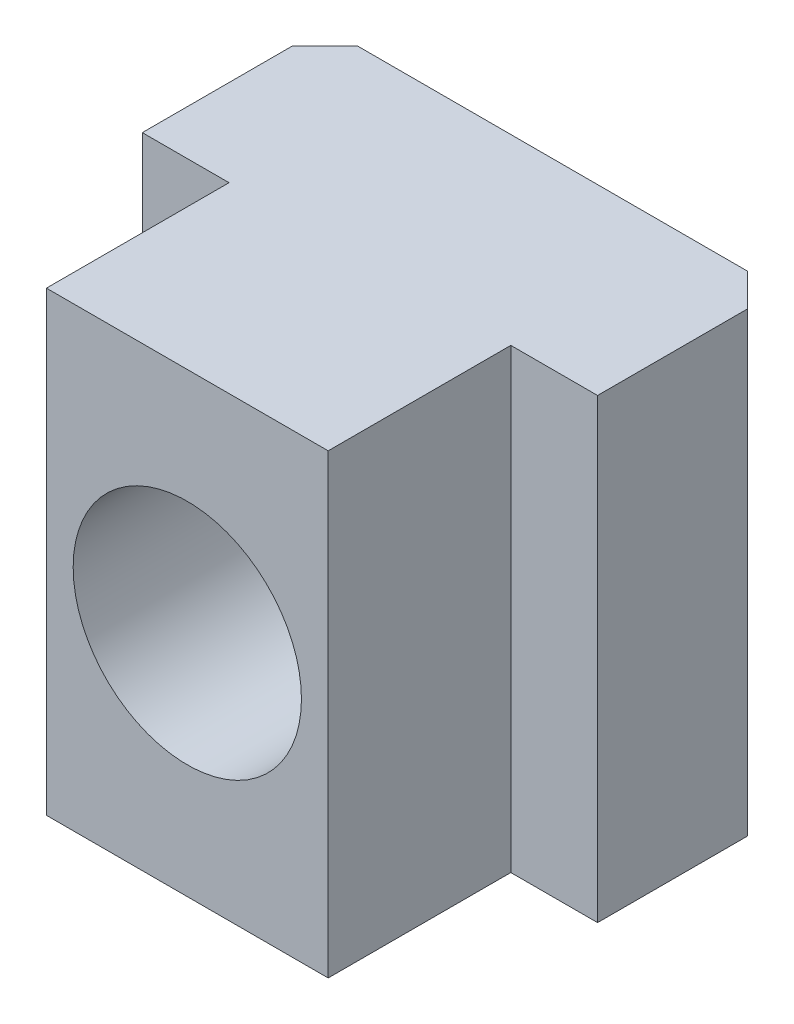
ISO-10303-21;
HEADER;
FILE_DESCRIPTION(('STEP AP214'),'2;1');
FILE_NAME('part.step','',(''),(''),'','','');
FILE_SCHEMA(('AUTOMOTIVE_DESIGN { 1 0 10303 214 1 1 1 1 }'));
ENDSEC;
DATA;
#1=APPLICATION_CONTEXT('core data for automotive mechanical design processes');
#2=APPLICATION_PROTOCOL_DEFINITION('international standard','automotive_design',2000,#1);
#3=PRODUCT_CONTEXT('',#1,'mechanical');
#4=PRODUCT('Part','Part','',(#3));
#5=PRODUCT_RELATED_PRODUCT_CATEGORY('part','',(#4));
#6=PRODUCT_DEFINITION_FORMATION('','',#4);
#7=PRODUCT_DEFINITION_CONTEXT('part definition',#1,'design');
#8=PRODUCT_DEFINITION('design','',#6,#7);
#9=PRODUCT_DEFINITION_SHAPE('','',#8);
#10=(LENGTH_UNIT() NAMED_UNIT(*) SI_UNIT(.MILLI.,.METRE.));
#11=(NAMED_UNIT(*) PLANE_ANGLE_UNIT() SI_UNIT($,.RADIAN.));
#12=(NAMED_UNIT(*) SI_UNIT($,.STERADIAN.) SOLID_ANGLE_UNIT());
#13=UNCERTAINTY_MEASURE_WITH_UNIT(LENGTH_MEASURE(1.E-05),#10,'distance_accuracy_value','');
#14=(GEOMETRIC_REPRESENTATION_CONTEXT(3) GLOBAL_UNCERTAINTY_ASSIGNED_CONTEXT((#13)) GLOBAL_UNIT_ASSIGNED_CONTEXT((#10,
#11,#12)) REPRESENTATION_CONTEXT('',''));
#15=CARTESIAN_POINT('',(0.,0.,0.));
#16=DIRECTION('',(0.,0.,1.));
#17=DIRECTION('',(1.,0.,0.));
#18=AXIS2_PLACEMENT_3D('',#15,#16,#17);
#19=CARTESIAN_POINT('',(-10.8,17.5,14.));
#20=DIRECTION('',(1.,0.,0.));
#21=DIRECTION('',(0.,0.,-1.));
#22=AXIS2_PLACEMENT_3D('',#19,#20,#21);
#23=PLANE('',#22);
#24=DIRECTION('',(0.,0.,1.));
#25=VECTOR('',#24,1.);
#26=CARTESIAN_POINT('',(-10.8,-17.5,14.));
#27=LINE('',#26,#25);
#28=CARTESIAN_POINT('',(-10.8,-17.5,0.));
#29=VERTEX_POINT('',#28);
#30=CARTESIAN_POINT('',(-10.8,-17.5,14.));
#31=VERTEX_POINT('',#30);
#32=EDGE_CURVE('E144',#29,#31,#27,.T.);
#33=ORIENTED_EDGE('',*,*,#32,.T.);
#34=DIRECTION('',(0.,-1.,0.));
#35=VECTOR('',#34,1.);
#36=CARTESIAN_POINT('',(-10.8,17.5,14.));
#37=LINE('',#36,#35);
#38=CARTESIAN_POINT('',(-10.8,17.5,14.));
#39=VERTEX_POINT('',#38);
#40=EDGE_CURVE('E11',#39,#31,#37,.T.);
#41=ORIENTED_EDGE('',*,*,#40,.F.);
#42=DIRECTION('',(0.,0.,1.));
#43=VECTOR('',#42,1.);
#44=CARTESIAN_POINT('',(-10.8,17.5,14.));
#45=LINE('',#44,#43);
#46=CARTESIAN_POINT('',(-10.8,17.5,0.));
#47=VERTEX_POINT('',#46);
#48=EDGE_CURVE('E163',#47,#39,#45,.T.);
#49=ORIENTED_EDGE('',*,*,#48,.F.);
#50=DIRECTION('',(0.,-1.,0.));
#51=VECTOR('',#50,1.);
#52=CARTESIAN_POINT('',(-10.8,17.5,0.));
#53=LINE('',#52,#51);
#54=EDGE_CURVE('E140',#47,#29,#53,.T.);
#55=ORIENTED_EDGE('',*,*,#54,.T.);
#56=EDGE_LOOP('',(#33,#41,#49,#55));
#57=FACE_BOUND('',#56,.T.);
#58=ADVANCED_FACE('F36',(#57),#23,.F.);
#59=CARTESIAN_POINT('',(10.8,17.5,14.));
#60=DIRECTION('',(0.,0.,-1.));
#61=DIRECTION('',(-1.,0.,0.));
#62=AXIS2_PLACEMENT_3D('',#59,#60,#61);
#63=PLANE('',#62);
#64=CARTESIAN_POINT('',(0.,0.,14.));
#65=DIRECTION('',(0.,0.,1.));
#66=DIRECTION('',(1.,0.,0.));
#67=AXIS2_PLACEMENT_3D('',#64,#65,#66);
#68=CIRCLE('',#67,8.75);
#69=CARTESIAN_POINT('',(8.75,0.,14.));
#70=VERTEX_POINT('',#69);
#71=EDGE_CURVE('E212',#70,#70,#68,.T.);
#72=ORIENTED_EDGE('',*,*,#71,.F.);
#73=EDGE_LOOP('',(#72));
#74=FACE_BOUND('',#73,.T.);
#75=DIRECTION('',(1.,0.,0.));
#76=VECTOR('',#75,1.);
#77=CARTESIAN_POINT('',(10.8,-17.5,14.));
#78=LINE('',#77,#76);
#79=CARTESIAN_POINT('',(10.8,-17.5,14.));
#80=VERTEX_POINT('',#79);
#81=EDGE_CURVE('E147',#31,#80,#78,.T.);
#82=ORIENTED_EDGE('',*,*,#81,.T.);
#83=DIRECTION('',(0.,-1.,0.));
#84=VECTOR('',#83,1.);
#85=CARTESIAN_POINT('',(10.8,17.5,14.));
#86=LINE('',#85,#84);
#87=CARTESIAN_POINT('',(10.8,17.5,14.));
#88=VERTEX_POINT('',#87);
#89=EDGE_CURVE('E44',#88,#80,#86,.T.);
#90=ORIENTED_EDGE('',*,*,#89,.F.);
#91=DIRECTION('',(1.,0.,0.));
#92=VECTOR('',#91,1.);
#93=CARTESIAN_POINT('',(10.8,17.5,14.));
#94=LINE('',#93,#92);
#95=EDGE_CURVE('E101',#39,#88,#94,.T.);
#96=ORIENTED_EDGE('',*,*,#95,.F.);
#97=ORIENTED_EDGE('',*,*,#40,.T.);
#98=EDGE_LOOP('',(#82,#90,#96,#97));
#99=FACE_BOUND('',#98,.T.);
#100=ADVANCED_FACE('F218',(#74,#99),#63,.F.);
#101=CARTESIAN_POINT('',(10.8,17.5,0.));
#102=DIRECTION('',(-1.,0.,0.));
#103=DIRECTION('',(0.,0.,1.));
#104=AXIS2_PLACEMENT_3D('',#101,#102,#103);
#105=PLANE('',#104);
#106=DIRECTION('',(0.,0.,-1.));
#107=VECTOR('',#106,1.);
#108=CARTESIAN_POINT('',(10.8,-17.5,0.));
#109=LINE('',#108,#107);
#110=CARTESIAN_POINT('',(10.8,-17.5,0.));
#111=VERTEX_POINT('',#110);
#112=EDGE_CURVE('E150',#80,#111,#109,.T.);
#113=ORIENTED_EDGE('',*,*,#112,.T.);
#114=DIRECTION('',(0.,-1.,0.));
#115=VECTOR('',#114,1.);
#116=CARTESIAN_POINT('',(10.8,17.5,0.));
#117=LINE('',#116,#115);
#118=CARTESIAN_POINT('',(10.8,17.5,0.));
#119=VERTEX_POINT('',#118);
#120=EDGE_CURVE('E176',#119,#111,#117,.T.);
#121=ORIENTED_EDGE('',*,*,#120,.F.);
#122=DIRECTION('',(0.,0.,-1.));
#123=VECTOR('',#122,1.);
#124=CARTESIAN_POINT('',(10.8,17.5,0.));
#125=LINE('',#124,#123);
#126=EDGE_CURVE('E184',#88,#119,#125,.T.);
#127=ORIENTED_EDGE('',*,*,#126,.F.);
#128=ORIENTED_EDGE('',*,*,#89,.T.);
#129=EDGE_LOOP('',(#113,#121,#127,#128));
#130=FACE_BOUND('',#129,.T.);
#131=ADVANCED_FACE('F182',(#130),#105,.F.);
#132=CARTESIAN_POINT('',(17.45,17.5,0.));
#133=DIRECTION('',(0.,0.,-1.));
#134=DIRECTION('',(-1.,0.,0.));
#135=AXIS2_PLACEMENT_3D('',#132,#133,#134);
#136=PLANE('',#135);
#137=DIRECTION('',(1.,0.,0.));
#138=VECTOR('',#137,1.);
#139=CARTESIAN_POINT('',(17.45,-17.5,0.));
#140=LINE('',#139,#138);
#141=CARTESIAN_POINT('',(17.45,-17.5,0.));
#142=VERTEX_POINT('',#141);
#143=EDGE_CURVE('E152',#111,#142,#140,.T.);
#144=ORIENTED_EDGE('',*,*,#143,.T.);
#145=DIRECTION('',(0.,-1.,0.));
#146=VECTOR('',#145,1.);
#147=CARTESIAN_POINT('',(17.45,17.5,0.));
#148=LINE('',#147,#146);
#149=CARTESIAN_POINT('',(17.45,17.5,0.));
#150=VERTEX_POINT('',#149);
#151=EDGE_CURVE('E173',#150,#142,#148,.T.);
#152=ORIENTED_EDGE('',*,*,#151,.F.);
#153=DIRECTION('',(1.,0.,0.));
#154=VECTOR('',#153,1.);
#155=CARTESIAN_POINT('',(17.45,17.5,0.));
#156=LINE('',#155,#154);
#157=EDGE_CURVE('E202',#119,#150,#156,.T.);
#158=ORIENTED_EDGE('',*,*,#157,.F.);
#159=ORIENTED_EDGE('',*,*,#120,.T.);
#160=EDGE_LOOP('',(#144,#152,#158,#159));
#161=FACE_BOUND('',#160,.T.);
#162=ADVANCED_FACE('F193',(#161),#136,.F.);
#163=CARTESIAN_POINT('',(17.45,17.5,-11.5));
#164=DIRECTION('',(-1.,0.,0.));
#165=DIRECTION('',(0.,0.,1.));
#166=AXIS2_PLACEMENT_3D('',#163,#164,#165);
#167=PLANE('',#166);
#168=DIRECTION('',(0.,0.,-1.));
#169=VECTOR('',#168,1.);
#170=CARTESIAN_POINT('',(17.45,-17.5,-11.5));
#171=LINE('',#170,#169);
#172=CARTESIAN_POINT('',(17.45,-17.5,-11.5));
#173=VERTEX_POINT('',#172);
#174=EDGE_CURVE('E154',#142,#173,#171,.T.);
#175=ORIENTED_EDGE('',*,*,#174,.T.);
#176=DIRECTION('',(0.,-1.,0.));
#177=VECTOR('',#176,1.);
#178=CARTESIAN_POINT('',(17.45,17.5,-11.5));
#179=LINE('',#178,#177);
#180=CARTESIAN_POINT('',(17.45,17.5,-11.5));
#181=VERTEX_POINT('',#180);
#182=EDGE_CURVE('E170',#181,#173,#179,.T.);
#183=ORIENTED_EDGE('',*,*,#182,.F.);
#184=DIRECTION('',(0.,0.,-1.));
#185=VECTOR('',#184,1.);
#186=CARTESIAN_POINT('',(17.45,17.5,-11.5));
#187=LINE('',#186,#185);
#188=EDGE_CURVE('E199',#150,#181,#187,.T.);
#189=ORIENTED_EDGE('',*,*,#188,.F.);
#190=ORIENTED_EDGE('',*,*,#151,.T.);
#191=EDGE_LOOP('',(#175,#183,#189,#190));
#192=FACE_BOUND('',#191,.T.);
#193=ADVANCED_FACE('F197',(#192),#167,.F.);
#194=CARTESIAN_POINT('',(14.95,17.5,-14.));
#195=DIRECTION('',(-0.707106781186548,0.,0.707106781186548));
#196=DIRECTION('',(0.707106781186548,0.,0.707106781186548));
#197=AXIS2_PLACEMENT_3D('',#194,#195,#196);
#198=PLANE('',#197);
#199=DIRECTION('',(-0.707106781186548,0.,-0.707106781186548));
#200=VECTOR('',#199,1.);
#201=CARTESIAN_POINT('',(14.95,-17.5,-14.));
#202=LINE('',#201,#200);
#203=CARTESIAN_POINT('',(14.95,-17.5,-14.));
#204=VERTEX_POINT('',#203);
#205=EDGE_CURVE('E156',#173,#204,#202,.T.);
#206=ORIENTED_EDGE('',*,*,#205,.T.);
#207=DIRECTION('',(0.,-1.,0.));
#208=VECTOR('',#207,1.);
#209=CARTESIAN_POINT('',(14.95,17.5,-14.));
#210=LINE('',#209,#208);
#211=CARTESIAN_POINT('',(14.95,17.5,-14.));
#212=VERTEX_POINT('',#211);
#213=EDGE_CURVE('E167',#212,#204,#210,.T.);
#214=ORIENTED_EDGE('',*,*,#213,.F.);
#215=DIRECTION('',(-0.707106781186548,0.,-0.707106781186548));
#216=VECTOR('',#215,1.);
#217=CARTESIAN_POINT('',(14.95,17.5,-14.));
#218=LINE('',#217,#216);
#219=EDGE_CURVE('E201',#181,#212,#218,.T.);
#220=ORIENTED_EDGE('',*,*,#219,.F.);
#221=ORIENTED_EDGE('',*,*,#182,.T.);
#222=EDGE_LOOP('',(#206,#214,#220,#221));
#223=FACE_BOUND('',#222,.T.);
#224=ADVANCED_FACE('F228',(#223),#198,.F.);
#225=CARTESIAN_POINT('',(-14.95,17.5,-14.));
#226=DIRECTION('',(0.,0.,1.));
#227=DIRECTION('',(1.,0.,0.));
#228=AXIS2_PLACEMENT_3D('',#225,#226,#227);
#229=PLANE('',#228);
#230=CARTESIAN_POINT('',(0.,0.,-14.));
#231=DIRECTION('',(0.,0.,1.));
#232=DIRECTION('',(1.,0.,0.));
#233=AXIS2_PLACEMENT_3D('',#230,#231,#232);
#234=CIRCLE('',#233,8.75);
#235=CARTESIAN_POINT('',(8.75,0.,-14.));
#236=VERTEX_POINT('',#235);
#237=EDGE_CURVE('E148',#236,#236,#234,.T.);
#238=ORIENTED_EDGE('',*,*,#237,.T.);
#239=EDGE_LOOP('',(#238));
#240=FACE_BOUND('',#239,.T.);
#241=DIRECTION('',(-1.,0.,0.));
#242=VECTOR('',#241,1.);
#243=CARTESIAN_POINT('',(-14.95,-17.5,-14.));
#244=LINE('',#243,#242);
#245=CARTESIAN_POINT('',(-14.95,-17.5,-14.));
#246=VERTEX_POINT('',#245);
#247=EDGE_CURVE('E158',#204,#246,#244,.T.);
#248=ORIENTED_EDGE('',*,*,#247,.T.);
#249=DIRECTION('',(0.,-1.,0.));
#250=VECTOR('',#249,1.);
#251=CARTESIAN_POINT('',(-14.95,17.5,-14.));
#252=LINE('',#251,#250);
#253=CARTESIAN_POINT('',(-14.95,17.5,-14.));
#254=VERTEX_POINT('',#253);
#255=EDGE_CURVE('E135',#254,#246,#252,.T.);
#256=ORIENTED_EDGE('',*,*,#255,.F.);
#257=DIRECTION('',(-1.,0.,0.));
#258=VECTOR('',#257,1.);
#259=CARTESIAN_POINT('',(-14.95,17.5,-14.));
#260=LINE('',#259,#258);
#261=EDGE_CURVE('E126',#212,#254,#260,.T.);
#262=ORIENTED_EDGE('',*,*,#261,.F.);
#263=ORIENTED_EDGE('',*,*,#213,.T.);
#264=EDGE_LOOP('',(#248,#256,#262,#263));
#265=FACE_BOUND('',#264,.T.);
#266=ADVANCED_FACE('F225',(#240,#265),#229,.F.);
#267=CARTESIAN_POINT('',(-17.45,17.5,-11.5));
#268=DIRECTION('',(0.707106781186548,0.,0.707106781186548));
#269=DIRECTION('',(0.707106781186548,0.,-0.707106781186548));
#270=AXIS2_PLACEMENT_3D('',#267,#268,#269);
#271=PLANE('',#270);
#272=DIRECTION('',(-0.707106781186548,0.,0.707106781186548));
#273=VECTOR('',#272,1.);
#274=CARTESIAN_POINT('',(-17.45,-17.5,-11.5));
#275=LINE('',#274,#273);
#276=CARTESIAN_POINT('',(-17.45,-17.5,-11.5));
#277=VERTEX_POINT('',#276);
#278=EDGE_CURVE('E134',#246,#277,#275,.T.);
#279=ORIENTED_EDGE('',*,*,#278,.T.);
#280=DIRECTION('',(0.,-1.,0.));
#281=VECTOR('',#280,1.);
#282=CARTESIAN_POINT('',(-17.45,17.5,-11.5));
#283=LINE('',#282,#281);
#284=CARTESIAN_POINT('',(-17.45,17.5,-11.5));
#285=VERTEX_POINT('',#284);
#286=EDGE_CURVE('E131',#285,#277,#283,.T.);
#287=ORIENTED_EDGE('',*,*,#286,.F.);
#288=DIRECTION('',(-0.707106781186548,0.,0.707106781186548));
#289=VECTOR('',#288,1.);
#290=CARTESIAN_POINT('',(-17.45,17.5,-11.5));
#291=LINE('',#290,#289);
#292=EDGE_CURVE('E120',#254,#285,#291,.T.);
#293=ORIENTED_EDGE('',*,*,#292,.F.);
#294=ORIENTED_EDGE('',*,*,#255,.T.);
#295=EDGE_LOOP('',(#279,#287,#293,#294));
#296=FACE_BOUND('',#295,.T.);
#297=ADVANCED_FACE('F132',(#296),#271,.F.);
#298=CARTESIAN_POINT('',(-17.45,17.5,0.));
#299=DIRECTION('',(1.,0.,0.));
#300=DIRECTION('',(0.,0.,-1.));
#301=AXIS2_PLACEMENT_3D('',#298,#299,#300);
#302=PLANE('',#301);
#303=DIRECTION('',(0.,0.,1.));
#304=VECTOR('',#303,1.);
#305=CARTESIAN_POINT('',(-17.45,-17.5,0.));
#306=LINE('',#305,#304);
#307=CARTESIAN_POINT('',(-17.45,-17.5,0.));
#308=VERTEX_POINT('',#307);
#309=EDGE_CURVE('E87',#277,#308,#306,.T.);
#310=ORIENTED_EDGE('',*,*,#309,.T.);
#311=DIRECTION('',(0.,-1.,0.));
#312=VECTOR('',#311,1.);
#313=CARTESIAN_POINT('',(-17.45,17.5,0.));
#314=LINE('',#313,#312);
#315=CARTESIAN_POINT('',(-17.45,17.5,0.));
#316=VERTEX_POINT('',#315);
#317=EDGE_CURVE('E136',#316,#308,#314,.T.);
#318=ORIENTED_EDGE('',*,*,#317,.F.);
#319=DIRECTION('',(0.,0.,1.));
#320=VECTOR('',#319,1.);
#321=CARTESIAN_POINT('',(-17.45,17.5,0.));
#322=LINE('',#321,#320);
#323=EDGE_CURVE('E124',#285,#316,#322,.T.);
#324=ORIENTED_EDGE('',*,*,#323,.F.);
#325=ORIENTED_EDGE('',*,*,#286,.T.);
#326=EDGE_LOOP('',(#310,#318,#324,#325));
#327=FACE_BOUND('',#326,.T.);
#328=ADVANCED_FACE('F138',(#327),#302,.F.);
#329=CARTESIAN_POINT('',(-10.8,17.5,0.));
#330=DIRECTION('',(0.,0.,-1.));
#331=DIRECTION('',(-1.,0.,0.));
#332=AXIS2_PLACEMENT_3D('',#329,#330,#331);
#333=PLANE('',#332);
#334=DIRECTION('',(1.,0.,0.));
#335=VECTOR('',#334,1.);
#336=CARTESIAN_POINT('',(-10.8,-17.5,0.));
#337=LINE('',#336,#335);
#338=EDGE_CURVE('E93',#308,#29,#337,.T.);
#339=ORIENTED_EDGE('',*,*,#338,.T.);
#340=ORIENTED_EDGE('',*,*,#54,.F.);
#341=DIRECTION('',(1.,0.,0.));
#342=VECTOR('',#341,1.);
#343=CARTESIAN_POINT('',(-10.8,17.5,0.));
#344=LINE('',#343,#342);
#345=EDGE_CURVE('E52',#316,#47,#344,.T.);
#346=ORIENTED_EDGE('',*,*,#345,.F.);
#347=ORIENTED_EDGE('',*,*,#317,.T.);
#348=EDGE_LOOP('',(#339,#340,#346,#347));
#349=FACE_BOUND('',#348,.T.);
#350=ADVANCED_FACE('F285',(#349),#333,.F.);
#351=CARTESIAN_POINT('',(0.,17.5,0.));
#352=DIRECTION('',(0.,1.,0.));
#353=DIRECTION('',(0.,0.,1.));
#354=AXIS2_PLACEMENT_3D('',#351,#352,#353);
#355=PLANE('',#354);
#356=ORIENTED_EDGE('',*,*,#48,.T.);
#357=ORIENTED_EDGE('',*,*,#95,.T.);
#358=ORIENTED_EDGE('',*,*,#126,.T.);
#359=ORIENTED_EDGE('',*,*,#157,.T.);
#360=ORIENTED_EDGE('',*,*,#188,.T.);
#361=ORIENTED_EDGE('',*,*,#219,.T.);
#362=ORIENTED_EDGE('',*,*,#261,.T.);
#363=ORIENTED_EDGE('',*,*,#292,.T.);
#364=ORIENTED_EDGE('',*,*,#323,.T.);
#365=ORIENTED_EDGE('',*,*,#345,.T.);
#366=EDGE_LOOP('',(#356,#357,#358,#359,#360,#361,#362,#363,#364,#365));
#367=FACE_BOUND('',#366,.T.);
#368=ADVANCED_FACE('F122',(#367),#355,.T.);
#369=CARTESIAN_POINT('',(0.,-17.5,0.));
#370=DIRECTION('',(0.,1.,0.));
#371=DIRECTION('',(0.,0.,1.));
#372=AXIS2_PLACEMENT_3D('',#369,#370,#371);
#373=PLANE('',#372);
#374=ORIENTED_EDGE('',*,*,#32,.F.);
#375=ORIENTED_EDGE('',*,*,#338,.F.);
#376=ORIENTED_EDGE('',*,*,#309,.F.);
#377=ORIENTED_EDGE('',*,*,#278,.F.);
#378=ORIENTED_EDGE('',*,*,#247,.F.);
#379=ORIENTED_EDGE('',*,*,#205,.F.);
#380=ORIENTED_EDGE('',*,*,#174,.F.);
#381=ORIENTED_EDGE('',*,*,#143,.F.);
#382=ORIENTED_EDGE('',*,*,#112,.F.);
#383=ORIENTED_EDGE('',*,*,#81,.F.);
#384=EDGE_LOOP('',(#374,#375,#376,#377,#378,#379,#380,#381,#382,#383));
#385=FACE_BOUND('',#384,.T.);
#386=ADVANCED_FACE('F188',(#385),#373,.F.);
#387=CARTESIAN_POINT('',(0.,0.,14.));
#388=DIRECTION('',(0.,0.,1.));
#389=DIRECTION('',(1.,0.,0.));
#390=AXIS2_PLACEMENT_3D('',#387,#388,#389);
#391=CYLINDRICAL_SURFACE('',#390,8.75);
#392=ORIENTED_EDGE('',*,*,#237,.F.);
#393=EDGE_LOOP('',(#392));
#394=FACE_BOUND('',#393,.T.);
#395=ORIENTED_EDGE('',*,*,#71,.T.);
#396=EDGE_LOOP('',(#395));
#397=FACE_BOUND('',#396,.T.);
#398=ADVANCED_FACE('F216',(#394,#397),#391,.F.);
#399=CLOSED_SHELL('',(#58,#100,#131,#162,#193,#224,#266,#297,#328,#350,#368,#386,#398));
#400=MANIFOLD_SOLID_BREP('B2',#399);
#401=ADVANCED_BREP_SHAPE_REPRESENTATION('',(#18,#400),#14);
#402=SHAPE_DEFINITION_REPRESENTATION(#9,#401);
ENDSEC;
END-ISO-10303-21;
